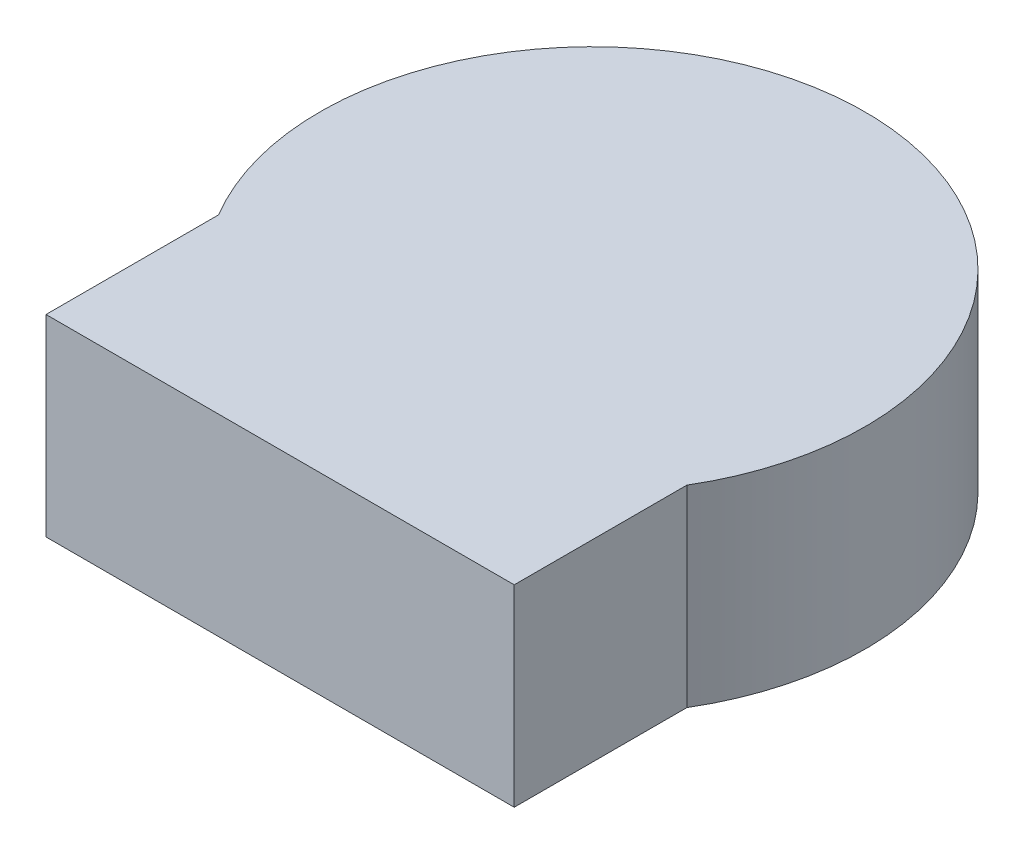
ISO-10303-21;
HEADER;
FILE_DESCRIPTION(('STEP AP214'),'2;1');
FILE_NAME('part.step','',(''),(''),'','','');
FILE_SCHEMA(('AUTOMOTIVE_DESIGN { 1 0 10303 214 1 1 1 1 }'));
ENDSEC;
DATA;
#1=APPLICATION_CONTEXT('core data for automotive mechanical design processes');
#2=APPLICATION_PROTOCOL_DEFINITION('international standard','automotive_design',2000,#1);
#3=PRODUCT_CONTEXT('',#1,'mechanical');
#4=PRODUCT('Part','Part','',(#3));
#5=PRODUCT_RELATED_PRODUCT_CATEGORY('part','',(#4));
#6=PRODUCT_DEFINITION_FORMATION('','',#4);
#7=PRODUCT_DEFINITION_CONTEXT('part definition',#1,'design');
#8=PRODUCT_DEFINITION('design','',#6,#7);
#9=PRODUCT_DEFINITION_SHAPE('','',#8);
#10=(LENGTH_UNIT() NAMED_UNIT(*) SI_UNIT(.MILLI.,.METRE.));
#11=(NAMED_UNIT(*) PLANE_ANGLE_UNIT() SI_UNIT($,.RADIAN.));
#12=(NAMED_UNIT(*) SI_UNIT($,.STERADIAN.) SOLID_ANGLE_UNIT());
#13=UNCERTAINTY_MEASURE_WITH_UNIT(LENGTH_MEASURE(1.E-05),#10,'distance_accuracy_value','');
#14=(GEOMETRIC_REPRESENTATION_CONTEXT(3) GLOBAL_UNCERTAINTY_ASSIGNED_CONTEXT((#13)) GLOBAL_UNIT_ASSIGNED_CONTEXT((#10,
#11,#12)) REPRESENTATION_CONTEXT('',''));
#15=CARTESIAN_POINT('',(0.,0.,0.));
#16=DIRECTION('',(0.,0.,1.));
#17=DIRECTION('',(1.,0.,0.));
#18=AXIS2_PLACEMENT_3D('',#15,#16,#17);
#19=CARTESIAN_POINT('',(-60.75,50.,0.));
#20=DIRECTION('',(-1.,0.,0.));
#21=DIRECTION('',(0.,0.,1.));
#22=AXIS2_PLACEMENT_3D('',#19,#20,#21);
#23=PLANE('',#22);
#24=DIRECTION('',(0.,0.,-1.));
#25=VECTOR('',#24,1.);
#26=CARTESIAN_POINT('',(-60.75,0.,0.));
#27=LINE('',#26,#25);
#28=CARTESIAN_POINT('',(-60.75,0.,81.05));
#29=VERTEX_POINT('',#28);
#30=CARTESIAN_POINT('',(-60.75,0.,36.2629287289375));
#31=VERTEX_POINT('',#30);
#32=EDGE_CURVE('E97',#29,#31,#27,.T.);
#33=ORIENTED_EDGE('',*,*,#32,.F.);
#34=DIRECTION('',(0.,-1.,0.));
#35=VECTOR('',#34,1.);
#36=CARTESIAN_POINT('',(-60.75,50.,81.05));
#37=LINE('',#36,#35);
#38=CARTESIAN_POINT('',(-60.75,50.,81.05));
#39=VERTEX_POINT('',#38);
#40=EDGE_CURVE('E59',#39,#29,#37,.T.);
#41=ORIENTED_EDGE('',*,*,#40,.F.);
#42=DIRECTION('',(0.,0.,-1.));
#43=VECTOR('',#42,1.);
#44=CARTESIAN_POINT('',(-60.75,50.,0.));
#45=LINE('',#44,#43);
#46=CARTESIAN_POINT('',(-60.75,50.,36.2629287289375));
#47=VERTEX_POINT('',#46);
#48=EDGE_CURVE('E95',#39,#47,#45,.T.);
#49=ORIENTED_EDGE('',*,*,#48,.T.);
#50=DIRECTION('',(0.,-1.,0.));
#51=VECTOR('',#50,1.);
#52=CARTESIAN_POINT('',(-60.75,50.,36.2629287289375));
#53=LINE('',#52,#51);
#54=EDGE_CURVE('E12',#47,#31,#53,.T.);
#55=ORIENTED_EDGE('',*,*,#54,.T.);
#56=EDGE_LOOP('',(#33,#41,#49,#55));
#57=FACE_BOUND('',#56,.T.);
#58=ADVANCED_FACE('F49',(#57),#23,.T.);
#59=CARTESIAN_POINT('',(0.,50.,81.05));
#60=DIRECTION('',(0.,0.,1.));
#61=DIRECTION('',(1.,0.,0.));
#62=AXIS2_PLACEMENT_3D('',#59,#60,#61);
#63=PLANE('',#62);
#64=DIRECTION('',(-1.,0.,0.));
#65=VECTOR('',#64,1.);
#66=CARTESIAN_POINT('',(0.,0.,81.05));
#67=LINE('',#66,#65);
#68=CARTESIAN_POINT('',(60.75,0.,81.05));
#69=VERTEX_POINT('',#68);
#70=EDGE_CURVE('E117',#69,#29,#67,.T.);
#71=ORIENTED_EDGE('',*,*,#70,.F.);
#72=DIRECTION('',(0.,-1.,0.));
#73=VECTOR('',#72,1.);
#74=CARTESIAN_POINT('',(60.75,50.,81.05));
#75=LINE('',#74,#73);
#76=CARTESIAN_POINT('',(60.75,50.,81.05));
#77=VERTEX_POINT('',#76);
#78=EDGE_CURVE('E81',#77,#69,#75,.T.);
#79=ORIENTED_EDGE('',*,*,#78,.F.);
#80=DIRECTION('',(-1.,0.,0.));
#81=VECTOR('',#80,1.);
#82=CARTESIAN_POINT('',(0.,50.,81.05));
#83=LINE('',#82,#81);
#84=EDGE_CURVE('E106',#77,#39,#83,.T.);
#85=ORIENTED_EDGE('',*,*,#84,.T.);
#86=ORIENTED_EDGE('',*,*,#40,.T.);
#87=EDGE_LOOP('',(#71,#79,#85,#86));
#88=FACE_BOUND('',#87,.T.);
#89=ADVANCED_FACE('F110',(#88),#63,.T.);
#90=CARTESIAN_POINT('',(60.75,50.,0.));
#91=DIRECTION('',(1.,0.,0.));
#92=DIRECTION('',(0.,0.,-1.));
#93=AXIS2_PLACEMENT_3D('',#90,#91,#92);
#94=PLANE('',#93);
#95=DIRECTION('',(0.,0.,1.));
#96=VECTOR('',#95,1.);
#97=CARTESIAN_POINT('',(60.75,0.,0.));
#98=LINE('',#97,#96);
#99=CARTESIAN_POINT('',(60.75,0.,36.2629287289375));
#100=VERTEX_POINT('',#99);
#101=EDGE_CURVE('E108',#100,#69,#98,.T.);
#102=ORIENTED_EDGE('',*,*,#101,.F.);
#103=DIRECTION('',(0.,-1.,0.));
#104=VECTOR('',#103,1.);
#105=CARTESIAN_POINT('',(60.75,50.,36.2629287289375));
#106=LINE('',#105,#104);
#107=CARTESIAN_POINT('',(60.75,50.,36.2629287289375));
#108=VERTEX_POINT('',#107);
#109=EDGE_CURVE('E68',#108,#100,#106,.T.);
#110=ORIENTED_EDGE('',*,*,#109,.F.);
#111=DIRECTION('',(0.,0.,1.));
#112=VECTOR('',#111,1.);
#113=CARTESIAN_POINT('',(60.75,50.,0.));
#114=LINE('',#113,#112);
#115=EDGE_CURVE('E111',#108,#77,#114,.T.);
#116=ORIENTED_EDGE('',*,*,#115,.T.);
#117=ORIENTED_EDGE('',*,*,#78,.T.);
#118=EDGE_LOOP('',(#102,#110,#116,#117));
#119=FACE_BOUND('',#118,.T.);
#120=ADVANCED_FACE('F160',(#119),#94,.T.);
#121=CARTESIAN_POINT('',(0.,0.,0.));
#122=DIRECTION('',(0.,1.,0.));
#123=DIRECTION('',(0.,0.,1.));
#124=AXIS2_PLACEMENT_3D('',#121,#122,#123);
#125=PLANE('',#124);
#126=CARTESIAN_POINT('',(43.3012701892218,0.,25.0000000000002));
#127=DIRECTION('',(0.,-1.,0.));
#128=DIRECTION('',(0.866025403784436,0.,0.500000000000004));
#129=AXIS2_PLACEMENT_3D('',#126,#127,#128);
#130=CIRCLE('',#129,1.5);
#131=CARTESIAN_POINT('',(44.6003082948985,0.,25.7500000000002));
#132=VERTEX_POINT('',#131);
#133=EDGE_CURVE('E142',#132,#132,#130,.T.);
#134=ORIENTED_EDGE('',*,*,#133,.F.);
#135=EDGE_LOOP('',(#134));
#136=FACE_BOUND('',#135,.T.);
#137=CARTESIAN_POINT('',(-43.3012701892222,0.,24.9999999999996));
#138=DIRECTION('',(0.,-1.,0.));
#139=DIRECTION('',(-0.866025403784443,0.,0.499999999999992));
#140=AXIS2_PLACEMENT_3D('',#137,#138,#139);
#141=CIRCLE('',#140,1.5);
#142=CARTESIAN_POINT('',(-44.6003082948988,0.,25.7499999999996));
#143=VERTEX_POINT('',#142);
#144=EDGE_CURVE('E132',#143,#143,#141,.T.);
#145=ORIENTED_EDGE('',*,*,#144,.F.);
#146=EDGE_LOOP('',(#145));
#147=FACE_BOUND('',#146,.T.);
#148=CARTESIAN_POINT('',(0.,0.,-50.));
#149=DIRECTION('',(0.,-1.,0.));
#150=DIRECTION('',(0.,0.,-1.));
#151=AXIS2_PLACEMENT_3D('',#148,#149,#150);
#152=CIRCLE('',#151,1.5);
#153=CARTESIAN_POINT('',(0.,0.,-51.5));
#154=VERTEX_POINT('',#153);
#155=EDGE_CURVE('E124',#154,#154,#152,.T.);
#156=ORIENTED_EDGE('',*,*,#155,.F.);
#157=EDGE_LOOP('',(#156));
#158=FACE_BOUND('',#157,.T.);
#159=CARTESIAN_POINT('',(0.,0.,0.));
#160=DIRECTION('',(0.,-1.,0.));
#161=DIRECTION('',(0.,0.,-1.));
#162=AXIS2_PLACEMENT_3D('',#159,#160,#161);
#163=CIRCLE('',#162,2.55);
#164=CARTESIAN_POINT('',(0.,0.,-2.55));
#165=VERTEX_POINT('',#164);
#166=EDGE_CURVE('E129',#165,#165,#163,.T.);
#167=ORIENTED_EDGE('',*,*,#166,.F.);
#168=EDGE_LOOP('',(#167));
#169=FACE_BOUND('',#168,.T.);
#170=ORIENTED_EDGE('',*,*,#32,.T.);
#171=CARTESIAN_POINT('',(0.,0.,0.));
#172=DIRECTION('',(0.,1.,0.));
#173=DIRECTION('',(0.,0.,1.));
#174=AXIS2_PLACEMENT_3D('',#171,#172,#173);
#175=CIRCLE('',#174,70.75);
#176=EDGE_CURVE('E53',#100,#31,#175,.T.);
#177=ORIENTED_EDGE('',*,*,#176,.F.);
#178=ORIENTED_EDGE('',*,*,#101,.T.);
#179=ORIENTED_EDGE('',*,*,#70,.T.);
#180=EDGE_LOOP('',(#170,#177,#178,#179));
#181=FACE_BOUND('',#180,.T.);
#182=ADVANCED_FACE('F157',(#136,#147,#158,#169,#181),#125,.F.);
#183=CARTESIAN_POINT('',(0.,50.,0.));
#184=DIRECTION('',(0.,1.,0.));
#185=DIRECTION('',(0.,0.,1.));
#186=AXIS2_PLACEMENT_3D('',#183,#184,#185);
#187=PLANE('',#186);
#188=ORIENTED_EDGE('',*,*,#115,.F.);
#189=CARTESIAN_POINT('',(0.,50.,0.));
#190=DIRECTION('',(0.,1.,0.));
#191=DIRECTION('',(0.,0.,1.));
#192=AXIS2_PLACEMENT_3D('',#189,#190,#191);
#193=CIRCLE('',#192,70.75);
#194=EDGE_CURVE('E107',#108,#47,#193,.T.);
#195=ORIENTED_EDGE('',*,*,#194,.T.);
#196=ORIENTED_EDGE('',*,*,#48,.F.);
#197=ORIENTED_EDGE('',*,*,#84,.F.);
#198=EDGE_LOOP('',(#188,#195,#196,#197));
#199=FACE_BOUND('',#198,.T.);
#200=ADVANCED_FACE('F105',(#199),#187,.T.);
#201=CARTESIAN_POINT('',(0.,50.,0.));
#202=DIRECTION('',(0.,-1.,0.));
#203=DIRECTION('',(0.,0.,-1.));
#204=AXIS2_PLACEMENT_3D('',#201,#202,#203);
#205=CYLINDRICAL_SURFACE('',#204,70.75);
#206=ORIENTED_EDGE('',*,*,#54,.F.);
#207=ORIENTED_EDGE('',*,*,#194,.F.);
#208=ORIENTED_EDGE('',*,*,#109,.T.);
#209=ORIENTED_EDGE('',*,*,#176,.T.);
#210=EDGE_LOOP('',(#206,#207,#208,#209));
#211=FACE_BOUND('',#210,.T.);
#212=ADVANCED_FACE('F51',(#211),#205,.T.);
#213=CARTESIAN_POINT('',(0.,5.,0.));
#214=DIRECTION('',(0.,-1.,0.));
#215=DIRECTION('',(0.,0.,-1.));
#216=AXIS2_PLACEMENT_3D('',#213,#214,#215);
#217=CYLINDRICAL_SURFACE('',#216,2.55);
#218=CARTESIAN_POINT('',(0.,5.,0.));
#219=DIRECTION('',(0.,-1.,0.));
#220=DIRECTION('',(0.,0.,-1.));
#221=AXIS2_PLACEMENT_3D('',#218,#219,#220);
#222=CIRCLE('',#221,2.55);
#223=CARTESIAN_POINT('',(0.,5.,-2.55));
#224=VERTEX_POINT('',#223);
#225=EDGE_CURVE('E136',#224,#224,#222,.T.);
#226=ORIENTED_EDGE('',*,*,#225,.F.);
#227=EDGE_LOOP('',(#226));
#228=FACE_BOUND('',#227,.T.);
#229=ORIENTED_EDGE('',*,*,#166,.T.);
#230=EDGE_LOOP('',(#229));
#231=FACE_BOUND('',#230,.T.);
#232=ADVANCED_FACE('F203',(#228,#231),#217,.F.);
#233=CARTESIAN_POINT('',(0.,5.,0.));
#234=DIRECTION('',(0.,-1.,0.));
#235=DIRECTION('',(0.,0.,-1.));
#236=AXIS2_PLACEMENT_3D('',#233,#234,#235);
#237=PLANE('',#236);
#238=ORIENTED_EDGE('',*,*,#225,.T.);
#239=EDGE_LOOP('',(#238));
#240=FACE_BOUND('',#239,.T.);
#241=ADVANCED_FACE('F211',(#240),#237,.T.);
#242=CARTESIAN_POINT('',(0.,5.,-50.));
#243=DIRECTION('',(0.,-1.,0.));
#244=DIRECTION('',(0.,0.,-1.));
#245=AXIS2_PLACEMENT_3D('',#242,#243,#244);
#246=CYLINDRICAL_SURFACE('',#245,1.5);
#247=CARTESIAN_POINT('',(0.,5.,-50.));
#248=DIRECTION('',(0.,-1.,0.));
#249=DIRECTION('',(0.,0.,-1.));
#250=AXIS2_PLACEMENT_3D('',#247,#248,#249);
#251=CIRCLE('',#250,1.5);
#252=CARTESIAN_POINT('',(0.,5.,-51.5));
#253=VERTEX_POINT('',#252);
#254=EDGE_CURVE('E122',#253,#253,#251,.T.);
#255=ORIENTED_EDGE('',*,*,#254,.F.);
#256=EDGE_LOOP('',(#255));
#257=FACE_BOUND('',#256,.T.);
#258=ORIENTED_EDGE('',*,*,#155,.T.);
#259=EDGE_LOOP('',(#258));
#260=FACE_BOUND('',#259,.T.);
#261=ADVANCED_FACE('F221',(#257,#260),#246,.F.);
#262=CARTESIAN_POINT('',(0.,5.,-50.));
#263=DIRECTION('',(0.,-1.,0.));
#264=DIRECTION('',(0.,0.,-1.));
#265=AXIS2_PLACEMENT_3D('',#262,#263,#264);
#266=PLANE('',#265);
#267=ORIENTED_EDGE('',*,*,#254,.T.);
#268=EDGE_LOOP('',(#267));
#269=FACE_BOUND('',#268,.T.);
#270=ADVANCED_FACE('F230',(#269),#266,.T.);
#271=CARTESIAN_POINT('',(-43.3012701892222,5.,24.9999999999996));
#272=DIRECTION('',(0.,-1.,0.));
#273=DIRECTION('',(0.,0.,-1.));
#274=AXIS2_PLACEMENT_3D('',#271,#272,#273);
#275=CYLINDRICAL_SURFACE('',#274,1.5);
#276=CARTESIAN_POINT('',(-43.3012701892222,5.,24.9999999999996));
#277=DIRECTION('',(0.,-1.,0.));
#278=DIRECTION('',(-0.866025403784443,0.,0.499999999999992));
#279=AXIS2_PLACEMENT_3D('',#276,#277,#278);
#280=CIRCLE('',#279,1.5);
#281=CARTESIAN_POINT('',(-44.6003082948988,5.,25.7499999999996));
#282=VERTEX_POINT('',#281);
#283=EDGE_CURVE('E147',#282,#282,#280,.T.);
#284=ORIENTED_EDGE('',*,*,#283,.F.);
#285=EDGE_LOOP('',(#284));
#286=FACE_BOUND('',#285,.T.);
#287=ORIENTED_EDGE('',*,*,#144,.T.);
#288=EDGE_LOOP('',(#287));
#289=FACE_BOUND('',#288,.T.);
#290=ADVANCED_FACE('F155',(#286,#289),#275,.F.);
#291=CARTESIAN_POINT('',(-43.3012701892222,5.,24.9999999999996));
#292=DIRECTION('',(0.,-1.,0.));
#293=DIRECTION('',(-0.866025403784443,0.,0.499999999999992));
#294=AXIS2_PLACEMENT_3D('',#291,#292,#293);
#295=PLANE('',#294);
#296=ORIENTED_EDGE('',*,*,#283,.T.);
#297=EDGE_LOOP('',(#296));
#298=FACE_BOUND('',#297,.T.);
#299=ADVANCED_FACE('F254',(#298),#295,.T.);
#300=CARTESIAN_POINT('',(43.3012701892218,5.,25.0000000000002));
#301=DIRECTION('',(0.,-1.,0.));
#302=DIRECTION('',(0.,0.,-1.));
#303=AXIS2_PLACEMENT_3D('',#300,#301,#302);
#304=CYLINDRICAL_SURFACE('',#303,1.5);
#305=CARTESIAN_POINT('',(43.3012701892218,5.,25.0000000000002));
#306=DIRECTION('',(0.,-1.,0.));
#307=DIRECTION('',(0.866025403784436,0.,0.500000000000004));
#308=AXIS2_PLACEMENT_3D('',#305,#306,#307);
#309=CIRCLE('',#308,1.5);
#310=CARTESIAN_POINT('',(44.6003082948985,5.,25.7500000000002));
#311=VERTEX_POINT('',#310);
#312=EDGE_CURVE('E138',#311,#311,#309,.T.);
#313=ORIENTED_EDGE('',*,*,#312,.F.);
#314=EDGE_LOOP('',(#313));
#315=FACE_BOUND('',#314,.T.);
#316=ORIENTED_EDGE('',*,*,#133,.T.);
#317=EDGE_LOOP('',(#316));
#318=FACE_BOUND('',#317,.T.);
#319=ADVANCED_FACE('F264',(#315,#318),#304,.F.);
#320=CARTESIAN_POINT('',(43.3012701892218,5.,25.0000000000002));
#321=DIRECTION('',(0.,-1.,0.));
#322=DIRECTION('',(0.866025403784436,0.,0.500000000000004));
#323=AXIS2_PLACEMENT_3D('',#320,#321,#322);
#324=PLANE('',#323);
#325=ORIENTED_EDGE('',*,*,#312,.T.);
#326=EDGE_LOOP('',(#325));
#327=FACE_BOUND('',#326,.T.);
#328=ADVANCED_FACE('F273',(#327),#324,.T.);
#329=CLOSED_SHELL('',(#58,#89,#120,#182,#200,#212,#232,#241,#261,#270,#290,#299,#319,#328));
#330=MANIFOLD_SOLID_BREP('B2',#329);
#331=ADVANCED_BREP_SHAPE_REPRESENTATION('',(#18,#330),#14);
#332=SHAPE_DEFINITION_REPRESENTATION(#9,#331);
ENDSEC;
END-ISO-10303-21;
